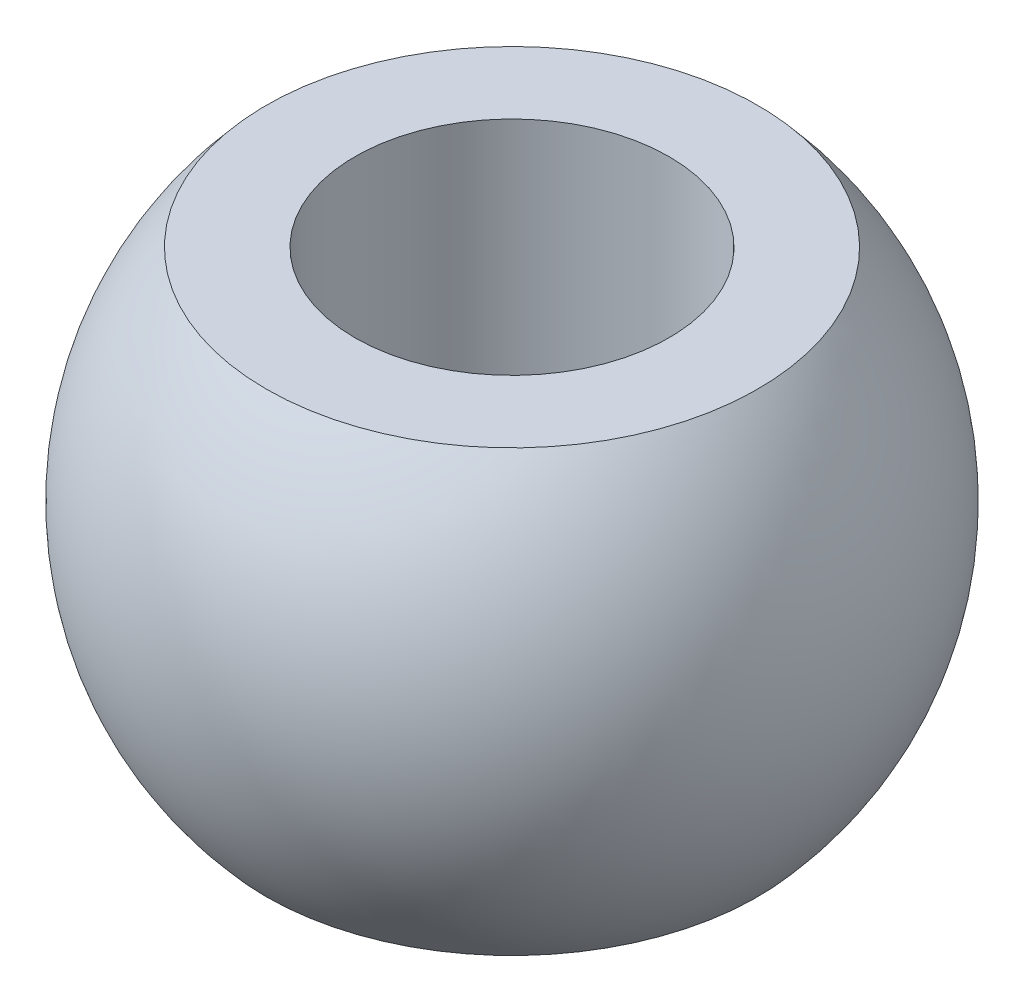
ISO-10303-21;
HEADER;
FILE_DESCRIPTION(('STEP AP214'),'2;1');
FILE_NAME('part.step','',(''),(''),'','','');
FILE_SCHEMA(('AUTOMOTIVE_DESIGN { 1 0 10303 214 1 1 1 1 }'));
ENDSEC;
DATA;
#1=APPLICATION_CONTEXT('core data for automotive mechanical design processes');
#2=APPLICATION_PROTOCOL_DEFINITION('international standard','automotive_design',2000,#1);
#3=PRODUCT_CONTEXT('',#1,'mechanical');
#4=PRODUCT('Part','Part','',(#3));
#5=PRODUCT_RELATED_PRODUCT_CATEGORY('part','',(#4));
#6=PRODUCT_DEFINITION_FORMATION('','',#4);
#7=PRODUCT_DEFINITION_CONTEXT('part definition',#1,'design');
#8=PRODUCT_DEFINITION('design','',#6,#7);
#9=PRODUCT_DEFINITION_SHAPE('','',#8);
#10=(LENGTH_UNIT() NAMED_UNIT(*) SI_UNIT(.MILLI.,.METRE.));
#11=(NAMED_UNIT(*) PLANE_ANGLE_UNIT() SI_UNIT($,.RADIAN.));
#12=(NAMED_UNIT(*) SI_UNIT($,.STERADIAN.) SOLID_ANGLE_UNIT());
#13=UNCERTAINTY_MEASURE_WITH_UNIT(LENGTH_MEASURE(1.E-05),#10,'distance_accuracy_value','');
#14=(GEOMETRIC_REPRESENTATION_CONTEXT(3) GLOBAL_UNCERTAINTY_ASSIGNED_CONTEXT((#13)) GLOBAL_UNIT_ASSIGNED_CONTEXT((#10,
#11,#12)) REPRESENTATION_CONTEXT('',''));
#15=CARTESIAN_POINT('',(0.,0.,0.));
#16=DIRECTION('',(0.,0.,1.));
#17=DIRECTION('',(1.,0.,0.));
#18=AXIS2_PLACEMENT_3D('',#15,#16,#17);
#19=CARTESIAN_POINT('',(0.,0.,0.));
#20=DIRECTION('',(0.,1.,0.));
#21=DIRECTION('',(0.,0.,1.));
#22=AXIS2_PLACEMENT_3D('',#19,#20,#21);
#23=CYLINDRICAL_SURFACE('',#22,5.);
#24=CARTESIAN_POINT('',(0.,-7.,0.));
#25=DIRECTION('',(0.,1.,0.));
#26=DIRECTION('',(0.,0.,1.));
#27=AXIS2_PLACEMENT_3D('',#24,#25,#26);
#28=CIRCLE('',#27,5.);
#29=CARTESIAN_POINT('',(0.,-7.,5.));
#30=VERTEX_POINT('',#29);
#31=EDGE_CURVE('E26',#30,#30,#28,.T.);
#32=ORIENTED_EDGE('',*,*,#31,.F.);
#33=EDGE_LOOP('',(#32));
#34=FACE_BOUND('',#33,.T.);
#35=CARTESIAN_POINT('',(0.,7.,0.));
#36=DIRECTION('',(0.,1.,0.));
#37=DIRECTION('',(0.,0.,1.));
#38=AXIS2_PLACEMENT_3D('',#35,#36,#37);
#39=CIRCLE('',#38,5.);
#40=CARTESIAN_POINT('',(0.,7.,5.));
#41=VERTEX_POINT('',#40);
#42=EDGE_CURVE('E17',#41,#41,#39,.F.);
#43=ORIENTED_EDGE('',*,*,#42,.F.);
#44=EDGE_LOOP('',(#43));
#45=FACE_BOUND('',#44,.T.);
#46=ADVANCED_FACE('F14',(#34,#45),#23,.F.);
#47=CARTESIAN_POINT('',(0.,7.,0.));
#48=DIRECTION('',(0.,1.,0.));
#49=DIRECTION('',(0.,0.,1.));
#50=AXIS2_PLACEMENT_3D('',#47,#48,#49);
#51=PLANE('',#50);
#52=ORIENTED_EDGE('',*,*,#42,.T.);
#53=EDGE_LOOP('',(#52));
#54=FACE_BOUND('',#53,.T.);
#55=CARTESIAN_POINT('',(0.,7.,0.));
#56=DIRECTION('',(0.,1.,0.));
#57=DIRECTION('',(0.,0.,1.));
#58=AXIS2_PLACEMENT_3D('',#55,#56,#57);
#59=CIRCLE('',#58,7.82623792124926);
#60=CARTESIAN_POINT('',(0.,7.,7.82623792124926));
#61=VERTEX_POINT('',#60);
#62=EDGE_CURVE('E21',#61,#61,#59,.F.);
#63=ORIENTED_EDGE('',*,*,#62,.F.);
#64=EDGE_LOOP('',(#63));
#65=FACE_BOUND('',#64,.T.);
#66=ADVANCED_FACE('F36',(#54,#65),#51,.T.);
#67=CARTESIAN_POINT('',(0.,-7.,0.));
#68=DIRECTION('',(0.,-1.,0.));
#69=DIRECTION('',(0.,0.,-1.));
#70=AXIS2_PLACEMENT_3D('',#67,#68,#69);
#71=PLANE('',#70);
#72=ORIENTED_EDGE('',*,*,#31,.T.);
#73=EDGE_LOOP('',(#72));
#74=FACE_BOUND('',#73,.T.);
#75=CARTESIAN_POINT('',(0.,-7.,0.));
#76=DIRECTION('',(0.,1.,0.));
#77=DIRECTION('',(0.,0.,1.));
#78=AXIS2_PLACEMENT_3D('',#75,#76,#77);
#79=CIRCLE('',#78,7.82623792124926);
#80=CARTESIAN_POINT('',(0.,-7.,7.82623792124926));
#81=VERTEX_POINT('',#80);
#82=EDGE_CURVE('E10',#81,#81,#79,.T.);
#83=ORIENTED_EDGE('',*,*,#82,.F.);
#84=EDGE_LOOP('',(#83));
#85=FACE_BOUND('',#84,.T.);
#86=ADVANCED_FACE('F45',(#74,#85),#71,.T.);
#87=CARTESIAN_POINT('',(0.,0.,0.));
#88=DIRECTION('',(0.,1.,0.));
#89=DIRECTION('',(-1.,0.,0.));
#90=AXIS2_PLACEMENT_3D('',#87,#88,#89);
#91=SPHERICAL_SURFACE('',#90,10.5);
#92=ORIENTED_EDGE('',*,*,#62,.T.);
#93=EDGE_LOOP('',(#92));
#94=FACE_BOUND('',#93,.T.);
#95=ORIENTED_EDGE('',*,*,#82,.T.);
#96=EDGE_LOOP('',(#95));
#97=FACE_BOUND('',#96,.T.);
#98=ADVANCED_FACE('F46',(#94,#97),#91,.T.);
#99=CLOSED_SHELL('',(#46,#66,#86,#98));
#100=MANIFOLD_SOLID_BREP('B1',#99);
#101=ADVANCED_BREP_SHAPE_REPRESENTATION('',(#18,#100),#14);
#102=SHAPE_DEFINITION_REPRESENTATION(#9,#101);
ENDSEC;
END-ISO-10303-21;
